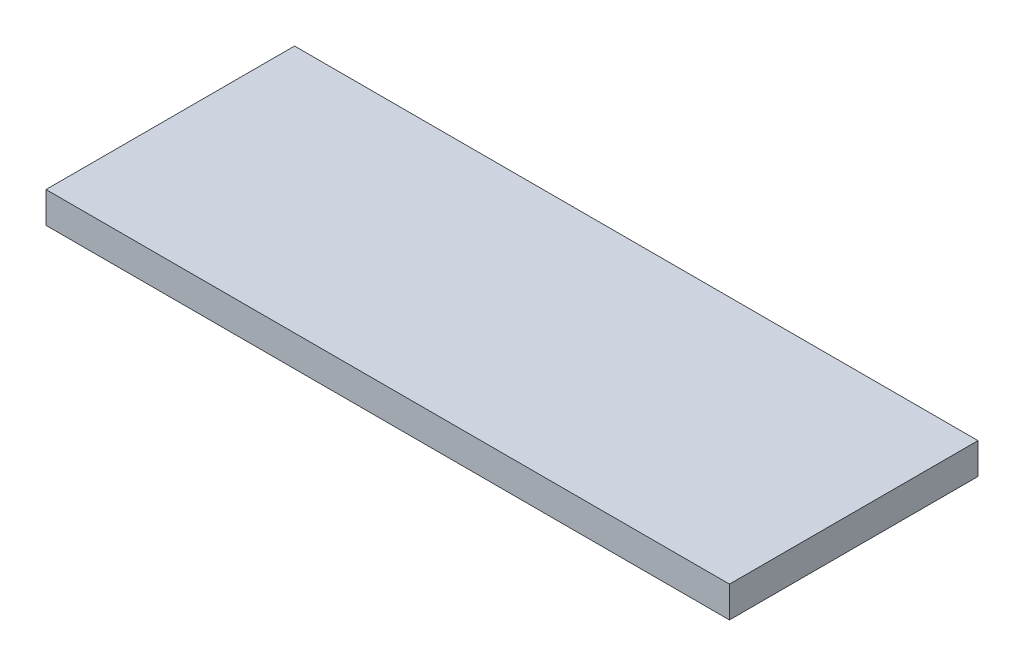
ISO-10303-21;
HEADER;
FILE_DESCRIPTION(('STEP AP214'),'2;1');
FILE_NAME('part.step','',(''),(''),'','','');
FILE_SCHEMA(('AUTOMOTIVE_DESIGN { 1 0 10303 214 1 1 1 1 }'));
ENDSEC;
DATA;
#1=APPLICATION_CONTEXT('core data for automotive mechanical design processes');
#2=APPLICATION_PROTOCOL_DEFINITION('international standard','automotive_design',2000,#1);
#3=PRODUCT_CONTEXT('',#1,'mechanical');
#4=PRODUCT('Part','Part','',(#3));
#5=PRODUCT_RELATED_PRODUCT_CATEGORY('part','',(#4));
#6=PRODUCT_DEFINITION_FORMATION('','',#4);
#7=PRODUCT_DEFINITION_CONTEXT('part definition',#1,'design');
#8=PRODUCT_DEFINITION('design','',#6,#7);
#9=PRODUCT_DEFINITION_SHAPE('','',#8);
#10=(LENGTH_UNIT() NAMED_UNIT(*) SI_UNIT(.MILLI.,.METRE.));
#11=(NAMED_UNIT(*) PLANE_ANGLE_UNIT() SI_UNIT($,.RADIAN.));
#12=(NAMED_UNIT(*) SI_UNIT($,.STERADIAN.) SOLID_ANGLE_UNIT());
#13=UNCERTAINTY_MEASURE_WITH_UNIT(LENGTH_MEASURE(1.E-05),#10,'distance_accuracy_value','');
#14=(GEOMETRIC_REPRESENTATION_CONTEXT(3) GLOBAL_UNCERTAINTY_ASSIGNED_CONTEXT((#13)) GLOBAL_UNIT_ASSIGNED_CONTEXT((#10,
#11,#12)) REPRESENTATION_CONTEXT('',''));
#15=CARTESIAN_POINT('',(0.,0.,0.));
#16=DIRECTION('',(0.,0.,1.));
#17=DIRECTION('',(1.,0.,0.));
#18=AXIS2_PLACEMENT_3D('',#15,#16,#17);
#19=CARTESIAN_POINT('',(22.,2.,-8.));
#20=DIRECTION('',(-1.,0.,0.));
#21=DIRECTION('',(0.,0.,1.));
#22=AXIS2_PLACEMENT_3D('',#19,#20,#21);
#23=PLANE('',#22);
#24=DIRECTION('',(0.,0.,-1.));
#25=VECTOR('',#24,1.);
#26=CARTESIAN_POINT('',(22.,0.,-8.));
#27=LINE('',#26,#25);
#28=CARTESIAN_POINT('',(22.,0.,8.));
#29=VERTEX_POINT('',#28);
#30=CARTESIAN_POINT('',(22.,0.,-8.));
#31=VERTEX_POINT('',#30);
#32=EDGE_CURVE('E100',#29,#31,#27,.T.);
#33=ORIENTED_EDGE('',*,*,#32,.T.);
#34=DIRECTION('',(0.,-1.,0.));
#35=VECTOR('',#34,1.);
#36=CARTESIAN_POINT('',(22.,2.,-8.));
#37=LINE('',#36,#35);
#38=CARTESIAN_POINT('',(22.,2.,-8.));
#39=VERTEX_POINT('',#38);
#40=EDGE_CURVE('E11',#39,#31,#37,.T.);
#41=ORIENTED_EDGE('',*,*,#40,.F.);
#42=DIRECTION('',(0.,0.,-1.));
#43=VECTOR('',#42,1.);
#44=CARTESIAN_POINT('',(22.,2.,-8.));
#45=LINE('',#44,#43);
#46=CARTESIAN_POINT('',(22.,2.,8.));
#47=VERTEX_POINT('',#46);
#48=EDGE_CURVE('E88',#47,#39,#45,.T.);
#49=ORIENTED_EDGE('',*,*,#48,.F.);
#50=DIRECTION('',(0.,-1.,0.));
#51=VECTOR('',#50,1.);
#52=CARTESIAN_POINT('',(22.,2.,8.));
#53=LINE('',#52,#51);
#54=EDGE_CURVE('E96',#47,#29,#53,.T.);
#55=ORIENTED_EDGE('',*,*,#54,.T.);
#56=EDGE_LOOP('',(#33,#41,#49,#55));
#57=FACE_BOUND('',#56,.T.);
#58=ADVANCED_FACE('F37',(#57),#23,.F.);
#59=CARTESIAN_POINT('',(-22.,2.,-8.));
#60=DIRECTION('',(0.,0.,1.));
#61=DIRECTION('',(1.,0.,0.));
#62=AXIS2_PLACEMENT_3D('',#59,#60,#61);
#63=PLANE('',#62);
#64=DIRECTION('',(-1.,0.,0.));
#65=VECTOR('',#64,1.);
#66=CARTESIAN_POINT('',(-22.,0.,-8.));
#67=LINE('',#66,#65);
#68=CARTESIAN_POINT('',(-22.,0.,-8.));
#69=VERTEX_POINT('',#68);
#70=EDGE_CURVE('E92',#31,#69,#67,.T.);
#71=ORIENTED_EDGE('',*,*,#70,.T.);
#72=DIRECTION('',(0.,-1.,0.));
#73=VECTOR('',#72,1.);
#74=CARTESIAN_POINT('',(-22.,2.,-8.));
#75=LINE('',#74,#73);
#76=CARTESIAN_POINT('',(-22.,2.,-8.));
#77=VERTEX_POINT('',#76);
#78=EDGE_CURVE('E45',#77,#69,#75,.T.);
#79=ORIENTED_EDGE('',*,*,#78,.F.);
#80=DIRECTION('',(-1.,0.,0.));
#81=VECTOR('',#80,1.);
#82=CARTESIAN_POINT('',(-22.,2.,-8.));
#83=LINE('',#82,#81);
#84=EDGE_CURVE('E83',#39,#77,#83,.T.);
#85=ORIENTED_EDGE('',*,*,#84,.F.);
#86=ORIENTED_EDGE('',*,*,#40,.T.);
#87=EDGE_LOOP('',(#71,#79,#85,#86));
#88=FACE_BOUND('',#87,.T.);
#89=ADVANCED_FACE('F91',(#88),#63,.F.);
#90=CARTESIAN_POINT('',(-22.,2.,-8.));
#91=DIRECTION('',(1.,0.,0.));
#92=DIRECTION('',(0.,0.,-1.));
#93=AXIS2_PLACEMENT_3D('',#90,#91,#92);
#94=PLANE('',#93);
#95=DIRECTION('',(0.,0.,1.));
#96=VECTOR('',#95,1.);
#97=CARTESIAN_POINT('',(-22.,0.,-8.));
#98=LINE('',#97,#96);
#99=CARTESIAN_POINT('',(-22.,0.,8.));
#100=VERTEX_POINT('',#99);
#101=EDGE_CURVE('E70',#69,#100,#98,.T.);
#102=ORIENTED_EDGE('',*,*,#101,.T.);
#103=DIRECTION('',(0.,-1.,0.));
#104=VECTOR('',#103,1.);
#105=CARTESIAN_POINT('',(-22.,2.,8.));
#106=LINE('',#105,#104);
#107=CARTESIAN_POINT('',(-22.,2.,8.));
#108=VERTEX_POINT('',#107);
#109=EDGE_CURVE('E93',#108,#100,#106,.T.);
#110=ORIENTED_EDGE('',*,*,#109,.F.);
#111=DIRECTION('',(0.,0.,1.));
#112=VECTOR('',#111,1.);
#113=CARTESIAN_POINT('',(-22.,2.,-8.));
#114=LINE('',#113,#112);
#115=EDGE_CURVE('E86',#77,#108,#114,.T.);
#116=ORIENTED_EDGE('',*,*,#115,.F.);
#117=ORIENTED_EDGE('',*,*,#78,.T.);
#118=EDGE_LOOP('',(#102,#110,#116,#117));
#119=FACE_BOUND('',#118,.T.);
#120=ADVANCED_FACE('F94',(#119),#94,.F.);
#121=CARTESIAN_POINT('',(-22.,2.,8.));
#122=DIRECTION('',(0.,0.,-1.));
#123=DIRECTION('',(-1.,0.,0.));
#124=AXIS2_PLACEMENT_3D('',#121,#122,#123);
#125=PLANE('',#124);
#126=DIRECTION('',(1.,0.,0.));
#127=VECTOR('',#126,1.);
#128=CARTESIAN_POINT('',(-22.,0.,8.));
#129=LINE('',#128,#127);
#130=EDGE_CURVE('E76',#100,#29,#129,.T.);
#131=ORIENTED_EDGE('',*,*,#130,.T.);
#132=ORIENTED_EDGE('',*,*,#54,.F.);
#133=DIRECTION('',(1.,0.,0.));
#134=VECTOR('',#133,1.);
#135=CARTESIAN_POINT('',(-22.,2.,8.));
#136=LINE('',#135,#134);
#137=EDGE_CURVE('E53',#108,#47,#136,.T.);
#138=ORIENTED_EDGE('',*,*,#137,.F.);
#139=ORIENTED_EDGE('',*,*,#109,.T.);
#140=EDGE_LOOP('',(#131,#132,#138,#139));
#141=FACE_BOUND('',#140,.T.);
#142=ADVANCED_FACE('F107',(#141),#125,.F.);
#143=CARTESIAN_POINT('',(0.,2.,0.));
#144=DIRECTION('',(0.,1.,0.));
#145=DIRECTION('',(0.,0.,1.));
#146=AXIS2_PLACEMENT_3D('',#143,#144,#145);
#147=PLANE('',#146);
#148=ORIENTED_EDGE('',*,*,#48,.T.);
#149=ORIENTED_EDGE('',*,*,#84,.T.);
#150=ORIENTED_EDGE('',*,*,#115,.T.);
#151=ORIENTED_EDGE('',*,*,#137,.T.);
#152=EDGE_LOOP('',(#148,#149,#150,#151));
#153=FACE_BOUND('',#152,.T.);
#154=ADVANCED_FACE('F84',(#153),#147,.T.);
#155=CARTESIAN_POINT('',(0.,0.,0.));
#156=DIRECTION('',(0.,1.,0.));
#157=DIRECTION('',(0.,0.,1.));
#158=AXIS2_PLACEMENT_3D('',#155,#156,#157);
#159=PLANE('',#158);
#160=ORIENTED_EDGE('',*,*,#32,.F.);
#161=ORIENTED_EDGE('',*,*,#130,.F.);
#162=ORIENTED_EDGE('',*,*,#101,.F.);
#163=ORIENTED_EDGE('',*,*,#70,.F.);
#164=EDGE_LOOP('',(#160,#161,#162,#163));
#165=FACE_BOUND('',#164,.T.);
#166=ADVANCED_FACE('F110',(#165),#159,.F.);
#167=CLOSED_SHELL('',(#58,#89,#120,#142,#154,#166));
#168=MANIFOLD_SOLID_BREP('B2',#167);
#169=ADVANCED_BREP_SHAPE_REPRESENTATION('',(#18,#168),#14);
#170=SHAPE_DEFINITION_REPRESENTATION(#9,#169);
ENDSEC;
END-ISO-10303-21;
